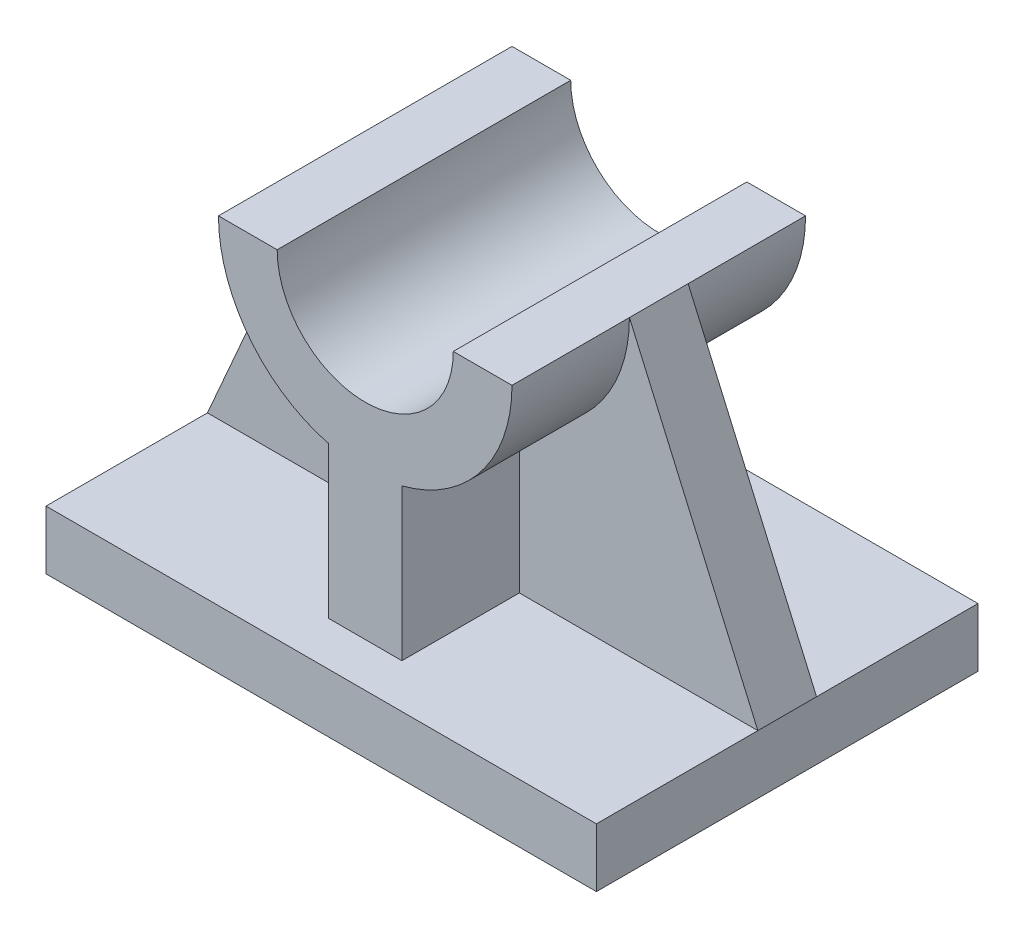
ISO-10303-21;
HEADER;
FILE_DESCRIPTION(('STEP AP214'),'2;1');
FILE_NAME('part.step','',(''),(''),'','','');
FILE_SCHEMA(('AUTOMOTIVE_DESIGN { 1 0 10303 214 1 1 1 1 }'));
ENDSEC;
DATA;
#1=APPLICATION_CONTEXT('core data for automotive mechanical design processes');
#2=APPLICATION_PROTOCOL_DEFINITION('international standard','automotive_design',2000,#1);
#3=PRODUCT_CONTEXT('',#1,'mechanical');
#4=PRODUCT('Part','Part','',(#3));
#5=PRODUCT_RELATED_PRODUCT_CATEGORY('part','',(#4));
#6=PRODUCT_DEFINITION_FORMATION('','',#4);
#7=PRODUCT_DEFINITION_CONTEXT('part definition',#1,'design');
#8=PRODUCT_DEFINITION('design','',#6,#7);
#9=PRODUCT_DEFINITION_SHAPE('','',#8);
#10=(LENGTH_UNIT() NAMED_UNIT(*) SI_UNIT(.MILLI.,.METRE.));
#11=(NAMED_UNIT(*) PLANE_ANGLE_UNIT() SI_UNIT($,.RADIAN.));
#12=(NAMED_UNIT(*) SI_UNIT($,.STERADIAN.) SOLID_ANGLE_UNIT());
#13=UNCERTAINTY_MEASURE_WITH_UNIT(LENGTH_MEASURE(1.E-05),#10,'distance_accuracy_value','');
#14=(GEOMETRIC_REPRESENTATION_CONTEXT(3) GLOBAL_UNCERTAINTY_ASSIGNED_CONTEXT((#13)) GLOBAL_UNIT_ASSIGNED_CONTEXT((#10,
#11,#12)) REPRESENTATION_CONTEXT('',''));
#15=CARTESIAN_POINT('',(0.,0.,0.));
#16=DIRECTION('',(0.,0.,1.));
#17=DIRECTION('',(1.,0.,0.));
#18=AXIS2_PLACEMENT_3D('',#15,#16,#17);
#19=CARTESIAN_POINT('',(0.,8.,26.));
#20=DIRECTION('',(0.,1.,0.));
#21=DIRECTION('',(0.,0.,1.));
#22=AXIS2_PLACEMENT_3D('',#19,#20,#21);
#23=PLANE('',#22);
#24=DIRECTION('',(0.,0.,-1.));
#25=VECTOR('',#24,1.);
#26=CARTESIAN_POINT('',(5.,8.,20.));
#27=LINE('',#26,#25);
#28=CARTESIAN_POINT('',(5.,8.,-4.));
#29=VERTEX_POINT('',#28);
#30=CARTESIAN_POINT('',(5.,8.,-20.));
#31=VERTEX_POINT('',#30);
#32=EDGE_CURVE('E337',#29,#31,#27,.T.);
#33=ORIENTED_EDGE('',*,*,#32,.F.);
#34=DIRECTION('',(1.,0.,0.));
#35=VECTOR('',#34,1.);
#36=CARTESIAN_POINT('',(0.,8.,-4.));
#37=LINE('',#36,#35);
#38=CARTESIAN_POINT('',(37.5,8.,-4.));
#39=VERTEX_POINT('',#38);
#40=EDGE_CURVE('E263',#29,#39,#37,.T.);
#41=ORIENTED_EDGE('',*,*,#40,.T.);
#42=DIRECTION('',(0.,0.,-1.));
#43=VECTOR('',#42,1.);
#44=CARTESIAN_POINT('',(37.5,8.,26.));
#45=LINE('',#44,#43);
#46=CARTESIAN_POINT('',(37.5,8.,-26.));
#47=VERTEX_POINT('',#46);
#48=EDGE_CURVE('E254',#39,#47,#45,.T.);
#49=ORIENTED_EDGE('',*,*,#48,.T.);
#50=DIRECTION('',(1.,0.,0.));
#51=VECTOR('',#50,1.);
#52=CARTESIAN_POINT('',(0.,8.,-26.));
#53=LINE('',#52,#51);
#54=CARTESIAN_POINT('',(-37.5,8.,-26.));
#55=VERTEX_POINT('',#54);
#56=EDGE_CURVE('E242',#55,#47,#53,.T.);
#57=ORIENTED_EDGE('',*,*,#56,.F.);
#58=DIRECTION('',(0.,0.,-1.));
#59=VECTOR('',#58,1.);
#60=CARTESIAN_POINT('',(-37.5,8.,26.));
#61=LINE('',#60,#59);
#62=CARTESIAN_POINT('',(-37.5,8.,-3.99999999999999));
#63=VERTEX_POINT('',#62);
#64=EDGE_CURVE('E67',#63,#55,#61,.T.);
#65=ORIENTED_EDGE('',*,*,#64,.F.);
#66=DIRECTION('',(1.,0.,0.));
#67=VECTOR('',#66,1.);
#68=CARTESIAN_POINT('',(0.,8.,-4.));
#69=LINE('',#68,#67);
#70=CARTESIAN_POINT('',(-5.,8.,-4.));
#71=VERTEX_POINT('',#70);
#72=EDGE_CURVE('E294',#63,#71,#69,.T.);
#73=ORIENTED_EDGE('',*,*,#72,.T.);
#74=DIRECTION('',(0.,0.,-1.));
#75=VECTOR('',#74,1.);
#76=CARTESIAN_POINT('',(-5.,8.,20.));
#77=LINE('',#76,#75);
#78=CARTESIAN_POINT('',(-5.,8.,-20.));
#79=VERTEX_POINT('',#78);
#80=EDGE_CURVE('E370',#71,#79,#77,.T.);
#81=ORIENTED_EDGE('',*,*,#80,.T.);
#82=DIRECTION('',(1.,0.,0.));
#83=VECTOR('',#82,1.);
#84=CARTESIAN_POINT('',(0.,8.,-20.));
#85=LINE('',#84,#83);
#86=EDGE_CURVE('E313',#79,#31,#85,.T.);
#87=ORIENTED_EDGE('',*,*,#86,.T.);
#88=EDGE_LOOP('',(#33,#41,#49,#57,#65,#73,#81,#87));
#89=FACE_BOUND('',#88,.T.);
#90=ADVANCED_FACE('F43',(#89),#23,.T.);
#91=CARTESIAN_POINT('',(5.,0.,20.));
#92=DIRECTION('',(1.,0.,0.));
#93=DIRECTION('',(0.,1.,0.));
#94=AXIS2_PLACEMENT_3D('',#91,#92,#93);
#95=PLANE('',#94);
#96=DIRECTION('',(0.,0.,-1.));
#97=VECTOR('',#96,1.);
#98=CARTESIAN_POINT('',(5.,28.6350832689629,20.));
#99=LINE('',#98,#97);
#100=CARTESIAN_POINT('',(5.,28.6350832689629,-4.));
#101=VERTEX_POINT('',#100);
#102=CARTESIAN_POINT('',(5.,28.6350832689629,-20.));
#103=VERTEX_POINT('',#102);
#104=EDGE_CURVE('E211',#101,#103,#99,.T.);
#105=ORIENTED_EDGE('',*,*,#104,.F.);
#106=DIRECTION('',(0.,-1.,0.));
#107=VECTOR('',#106,1.);
#108=CARTESIAN_POINT('',(5.,0.,-4.));
#109=LINE('',#108,#107);
#110=EDGE_CURVE('E431',#101,#29,#109,.T.);
#111=ORIENTED_EDGE('',*,*,#110,.T.);
#112=ORIENTED_EDGE('',*,*,#32,.T.);
#113=DIRECTION('',(0.,-1.,0.));
#114=VECTOR('',#113,1.);
#115=CARTESIAN_POINT('',(5.,0.,-20.));
#116=LINE('',#115,#114);
#117=EDGE_CURVE('E309',#103,#31,#116,.T.);
#118=ORIENTED_EDGE('',*,*,#117,.F.);
#119=EDGE_LOOP('',(#105,#111,#112,#118));
#120=FACE_BOUND('',#119,.T.);
#121=ADVANCED_FACE('F465',(#120),#95,.T.);
#122=CARTESIAN_POINT('',(0.,48.,20.));
#123=DIRECTION('',(0.,0.,-1.));
#124=DIRECTION('',(-1.,0.,0.));
#125=AXIS2_PLACEMENT_3D('',#122,#123,#124);
#126=CYLINDRICAL_SURFACE('',#125,20.);
#127=CARTESIAN_POINT('',(0.,48.,-4.));
#128=DIRECTION('',(0.,0.,1.));
#129=DIRECTION('',(1.,0.,0.));
#130=AXIS2_PLACEMENT_3D('',#127,#128,#129);
#131=CIRCLE('',#130,20.);
#132=CARTESIAN_POINT('',(20.,48.,-4.));
#133=VERTEX_POINT('',#132);
#134=EDGE_CURVE('E428',#101,#133,#131,.T.);
#135=ORIENTED_EDGE('',*,*,#134,.F.);
#136=ORIENTED_EDGE('',*,*,#104,.T.);
#137=CARTESIAN_POINT('',(0.,48.,-20.));
#138=DIRECTION('',(0.,0.,1.));
#139=DIRECTION('',(1.,0.,0.));
#140=AXIS2_PLACEMENT_3D('',#137,#138,#139);
#141=CIRCLE('',#140,20.);
#142=CARTESIAN_POINT('',(20.,48.,-20.));
#143=VERTEX_POINT('',#142);
#144=EDGE_CURVE('E341',#103,#143,#141,.T.);
#145=ORIENTED_EDGE('',*,*,#144,.T.);
#146=DIRECTION('',(0.,0.,-1.));
#147=VECTOR('',#146,1.);
#148=CARTESIAN_POINT('',(20.,48.,20.));
#149=LINE('',#148,#147);
#150=EDGE_CURVE('E389',#133,#143,#149,.T.);
#151=ORIENTED_EDGE('',*,*,#150,.F.);
#152=EDGE_LOOP('',(#135,#136,#145,#151));
#153=FACE_BOUND('',#152,.T.);
#154=ADVANCED_FACE('F480',(#153),#126,.T.);
#155=CARTESIAN_POINT('',(0.,48.,20.));
#156=DIRECTION('',(0.,0.,-1.));
#157=DIRECTION('',(-1.,0.,0.));
#158=AXIS2_PLACEMENT_3D('',#155,#156,#157);
#159=CYLINDRICAL_SURFACE('',#158,20.);
#160=CARTESIAN_POINT('',(0.,48.,-4.));
#161=DIRECTION('',(0.,0.,1.));
#162=DIRECTION('',(1.,0.,0.));
#163=AXIS2_PLACEMENT_3D('',#160,#161,#162);
#164=CIRCLE('',#163,20.);
#165=CARTESIAN_POINT('',(-20.,48.,-4.));
#166=VERTEX_POINT('',#165);
#167=CARTESIAN_POINT('',(-5.,28.6350832689629,-4.));
#168=VERTEX_POINT('',#167);
#169=EDGE_CURVE('E295',#166,#168,#164,.T.);
#170=ORIENTED_EDGE('',*,*,#169,.F.);
#171=DIRECTION('',(0.,0.,-1.));
#172=VECTOR('',#171,1.);
#173=CARTESIAN_POINT('',(-20.,48.,20.));
#174=LINE('',#173,#172);
#175=CARTESIAN_POINT('',(-20.,48.,-20.));
#176=VERTEX_POINT('',#175);
#177=EDGE_CURVE('E380',#166,#176,#174,.T.);
#178=ORIENTED_EDGE('',*,*,#177,.T.);
#179=CARTESIAN_POINT('',(0.,48.,-20.));
#180=DIRECTION('',(0.,0.,1.));
#181=DIRECTION('',(1.,0.,0.));
#182=AXIS2_PLACEMENT_3D('',#179,#180,#181);
#183=CIRCLE('',#182,20.);
#184=CARTESIAN_POINT('',(-5.,28.6350832689629,-20.));
#185=VERTEX_POINT('',#184);
#186=EDGE_CURVE('E357',#176,#185,#183,.T.);
#187=ORIENTED_EDGE('',*,*,#186,.T.);
#188=DIRECTION('',(0.,0.,-1.));
#189=VECTOR('',#188,1.);
#190=CARTESIAN_POINT('',(-5.,28.6350832689629,20.));
#191=LINE('',#190,#189);
#192=EDGE_CURVE('E375',#168,#185,#191,.T.);
#193=ORIENTED_EDGE('',*,*,#192,.F.);
#194=EDGE_LOOP('',(#170,#178,#187,#193));
#195=FACE_BOUND('',#194,.T.);
#196=ADVANCED_FACE('F456',(#195),#159,.T.);
#197=CARTESIAN_POINT('',(-5.,0.,20.));
#198=DIRECTION('',(1.,0.,0.));
#199=DIRECTION('',(0.,1.,0.));
#200=AXIS2_PLACEMENT_3D('',#197,#198,#199);
#201=PLANE('',#200);
#202=DIRECTION('',(0.,-1.,0.));
#203=VECTOR('',#202,1.);
#204=CARTESIAN_POINT('',(-5.,0.,-4.));
#205=LINE('',#204,#203);
#206=EDGE_CURVE('E299',#168,#71,#205,.T.);
#207=ORIENTED_EDGE('',*,*,#206,.F.);
#208=ORIENTED_EDGE('',*,*,#192,.T.);
#209=DIRECTION('',(0.,-1.,0.));
#210=VECTOR('',#209,1.);
#211=CARTESIAN_POINT('',(-5.,0.,-20.));
#212=LINE('',#211,#210);
#213=EDGE_CURVE('E361',#185,#79,#212,.T.);
#214=ORIENTED_EDGE('',*,*,#213,.T.);
#215=ORIENTED_EDGE('',*,*,#80,.F.);
#216=EDGE_LOOP('',(#207,#208,#214,#215));
#217=FACE_BOUND('',#216,.T.);
#218=ADVANCED_FACE('F472',(#217),#201,.F.);
#219=CARTESIAN_POINT('',(0.,0.,26.));
#220=DIRECTION('',(0.,1.,0.));
#221=DIRECTION('',(-1.,0.,0.));
#222=AXIS2_PLACEMENT_3D('',#219,#220,#221);
#223=PLANE('',#222);
#224=DIRECTION('',(1.,0.,0.));
#225=VECTOR('',#224,1.);
#226=CARTESIAN_POINT('',(0.,0.,-26.));
#227=LINE('',#226,#225);
#228=CARTESIAN_POINT('',(-37.5,0.,-26.));
#229=VERTEX_POINT('',#228);
#230=CARTESIAN_POINT('',(37.5,0.,-26.));
#231=VERTEX_POINT('',#230);
#232=EDGE_CURVE('E210',#229,#231,#227,.T.);
#233=ORIENTED_EDGE('',*,*,#232,.T.);
#234=DIRECTION('',(0.,0.,-1.));
#235=VECTOR('',#234,1.);
#236=CARTESIAN_POINT('',(37.5,0.,26.));
#237=LINE('',#236,#235);
#238=CARTESIAN_POINT('',(37.5,0.,26.));
#239=VERTEX_POINT('',#238);
#240=EDGE_CURVE('E11',#239,#231,#237,.T.);
#241=ORIENTED_EDGE('',*,*,#240,.F.);
#242=DIRECTION('',(1.,0.,0.));
#243=VECTOR('',#242,1.);
#244=CARTESIAN_POINT('',(0.,0.,26.));
#245=LINE('',#244,#243);
#246=CARTESIAN_POINT('',(-37.5,0.,26.));
#247=VERTEX_POINT('',#246);
#248=EDGE_CURVE('E222',#247,#239,#245,.T.);
#249=ORIENTED_EDGE('',*,*,#248,.F.);
#250=DIRECTION('',(0.,0.,-1.));
#251=VECTOR('',#250,1.);
#252=CARTESIAN_POINT('',(-37.5,0.,26.));
#253=LINE('',#252,#251);
#254=EDGE_CURVE('E237',#247,#229,#253,.T.);
#255=ORIENTED_EDGE('',*,*,#254,.T.);
#256=EDGE_LOOP('',(#233,#241,#249,#255));
#257=FACE_BOUND('',#256,.T.);
#258=ADVANCED_FACE('F45',(#257),#223,.F.);
#259=CARTESIAN_POINT('',(37.5,0.,26.));
#260=DIRECTION('',(-1.,0.,0.));
#261=DIRECTION('',(0.,0.,1.));
#262=AXIS2_PLACEMENT_3D('',#259,#260,#261);
#263=PLANE('',#262);
#264=DIRECTION('',(0.,1.,0.));
#265=VECTOR('',#264,1.);
#266=CARTESIAN_POINT('',(37.5,0.,-26.));
#267=LINE('',#266,#265);
#268=EDGE_CURVE('E216',#231,#47,#267,.T.);
#269=ORIENTED_EDGE('',*,*,#268,.T.);
#270=ORIENTED_EDGE('',*,*,#48,.F.);
#271=DIRECTION('',(0.,0.,-1.));
#272=VECTOR('',#271,1.);
#273=CARTESIAN_POINT('',(37.5,8.,4.));
#274=LINE('',#273,#272);
#275=CARTESIAN_POINT('',(37.5,8.,4.));
#276=VERTEX_POINT('',#275);
#277=EDGE_CURVE('E441',#276,#39,#274,.T.);
#278=ORIENTED_EDGE('',*,*,#277,.F.);
#279=CARTESIAN_POINT('',(37.5,8.,26.));
#280=VERTEX_POINT('',#279);
#281=EDGE_CURVE('E52',#280,#276,#45,.T.);
#282=ORIENTED_EDGE('',*,*,#281,.F.);
#283=DIRECTION('',(0.,1.,0.));
#284=VECTOR('',#283,1.);
#285=CARTESIAN_POINT('',(37.5,0.,26.));
#286=LINE('',#285,#284);
#287=EDGE_CURVE('E226',#239,#280,#286,.T.);
#288=ORIENTED_EDGE('',*,*,#287,.F.);
#289=ORIENTED_EDGE('',*,*,#240,.T.);
#290=EDGE_LOOP('',(#269,#270,#278,#282,#288,#289));
#291=FACE_BOUND('',#290,.T.);
#292=ADVANCED_FACE('F266',(#291),#263,.F.);
#293=DIRECTION('',(1.,0.,0.));
#294=VECTOR('',#293,1.);
#295=CARTESIAN_POINT('',(0.,8.,4.));
#296=LINE('',#295,#294);
#297=CARTESIAN_POINT('',(5.,8.,4.));
#298=VERTEX_POINT('',#297);
#299=EDGE_CURVE('E204',#298,#276,#296,.T.);
#300=ORIENTED_EDGE('',*,*,#299,.F.);
#301=CARTESIAN_POINT('',(5.,8.,20.));
#302=VERTEX_POINT('',#301);
#303=EDGE_CURVE('E202',#302,#298,#27,.T.);
#304=ORIENTED_EDGE('',*,*,#303,.F.);
#305=DIRECTION('',(1.,0.,0.));
#306=VECTOR('',#305,1.);
#307=CARTESIAN_POINT('',(0.,8.,20.));
#308=LINE('',#307,#306);
#309=CARTESIAN_POINT('',(-5.,8.,20.));
#310=VERTEX_POINT('',#309);
#311=EDGE_CURVE('E334',#310,#302,#308,.T.);
#312=ORIENTED_EDGE('',*,*,#311,.F.);
#313=CARTESIAN_POINT('',(-5.,8.,4.));
#314=VERTEX_POINT('',#313);
#315=EDGE_CURVE('E371',#310,#314,#77,.T.);
#316=ORIENTED_EDGE('',*,*,#315,.T.);
#317=DIRECTION('',(1.,0.,0.));
#318=VECTOR('',#317,1.);
#319=CARTESIAN_POINT('',(0.,8.,4.));
#320=LINE('',#319,#318);
#321=CARTESIAN_POINT('',(-37.5,8.,4.00000000000001));
#322=VERTEX_POINT('',#321);
#323=EDGE_CURVE('E449',#322,#314,#320,.T.);
#324=ORIENTED_EDGE('',*,*,#323,.F.);
#325=CARTESIAN_POINT('',(-37.5,8.,26.));
#326=VERTEX_POINT('',#325);
#327=EDGE_CURVE('E251',#326,#322,#61,.T.);
#328=ORIENTED_EDGE('',*,*,#327,.F.);
#329=DIRECTION('',(1.,0.,0.));
#330=VECTOR('',#329,1.);
#331=CARTESIAN_POINT('',(0.,8.,26.));
#332=LINE('',#331,#330);
#333=EDGE_CURVE('E230',#326,#280,#332,.T.);
#334=ORIENTED_EDGE('',*,*,#333,.T.);
#335=ORIENTED_EDGE('',*,*,#281,.T.);
#336=EDGE_LOOP('',(#300,#304,#312,#316,#324,#328,#334,#335));
#337=FACE_BOUND('',#336,.T.);
#338=ADVANCED_FACE('F422',(#337),#23,.T.);
#339=CARTESIAN_POINT('',(-37.5,0.,26.));
#340=DIRECTION('',(-1.,0.,0.));
#341=DIRECTION('',(0.,0.,1.));
#342=AXIS2_PLACEMENT_3D('',#339,#340,#341);
#343=PLANE('',#342);
#344=DIRECTION('',(0.,1.,0.));
#345=VECTOR('',#344,1.);
#346=CARTESIAN_POINT('',(-37.5,0.,-26.));
#347=LINE('',#346,#345);
#348=EDGE_CURVE('E227',#229,#55,#347,.T.);
#349=ORIENTED_EDGE('',*,*,#348,.F.);
#350=ORIENTED_EDGE('',*,*,#254,.F.);
#351=DIRECTION('',(0.,1.,0.));
#352=VECTOR('',#351,1.);
#353=CARTESIAN_POINT('',(-37.5,0.,26.));
#354=LINE('',#353,#352);
#355=EDGE_CURVE('E234',#247,#326,#354,.T.);
#356=ORIENTED_EDGE('',*,*,#355,.T.);
#357=ORIENTED_EDGE('',*,*,#327,.T.);
#358=DIRECTION('',(0.,0.,-1.));
#359=VECTOR('',#358,1.);
#360=CARTESIAN_POINT('',(-37.5,8.,4.));
#361=LINE('',#360,#359);
#362=EDGE_CURVE('E276',#322,#63,#361,.T.);
#363=ORIENTED_EDGE('',*,*,#362,.T.);
#364=ORIENTED_EDGE('',*,*,#64,.T.);
#365=EDGE_LOOP('',(#349,#350,#356,#357,#363,#364));
#366=FACE_BOUND('',#365,.T.);
#367=ADVANCED_FACE('F273',(#366),#343,.T.);
#368=CARTESIAN_POINT('',(0.,0.,26.));
#369=DIRECTION('',(0.,0.,1.));
#370=DIRECTION('',(1.,0.,0.));
#371=AXIS2_PLACEMENT_3D('',#368,#369,#370);
#372=PLANE('',#371);
#373=ORIENTED_EDGE('',*,*,#248,.T.);
#374=ORIENTED_EDGE('',*,*,#287,.T.);
#375=ORIENTED_EDGE('',*,*,#333,.F.);
#376=ORIENTED_EDGE('',*,*,#355,.F.);
#377=EDGE_LOOP('',(#373,#374,#375,#376));
#378=FACE_BOUND('',#377,.T.);
#379=ADVANCED_FACE('F496',(#378),#372,.T.);
#380=CARTESIAN_POINT('',(0.,0.,-26.));
#381=DIRECTION('',(0.,0.,1.));
#382=DIRECTION('',(1.,0.,0.));
#383=AXIS2_PLACEMENT_3D('',#380,#381,#382);
#384=PLANE('',#383);
#385=ORIENTED_EDGE('',*,*,#232,.F.);
#386=ORIENTED_EDGE('',*,*,#348,.T.);
#387=ORIENTED_EDGE('',*,*,#56,.T.);
#388=ORIENTED_EDGE('',*,*,#268,.F.);
#389=EDGE_LOOP('',(#385,#386,#387,#388));
#390=FACE_BOUND('',#389,.T.);
#391=ADVANCED_FACE('F270',(#390),#384,.F.);
#392=DIRECTION('',(0.,-1.,0.));
#393=VECTOR('',#392,1.);
#394=CARTESIAN_POINT('',(5.,0.,4.));
#395=LINE('',#394,#393);
#396=CARTESIAN_POINT('',(5.,28.6350832689629,4.));
#397=VERTEX_POINT('',#396);
#398=EDGE_CURVE('E185',#397,#298,#395,.T.);
#399=ORIENTED_EDGE('',*,*,#398,.F.);
#400=CARTESIAN_POINT('',(5.,28.6350832689629,20.));
#401=VERTEX_POINT('',#400);
#402=EDGE_CURVE('E199',#401,#397,#99,.T.);
#403=ORIENTED_EDGE('',*,*,#402,.F.);
#404=DIRECTION('',(0.,-1.,0.));
#405=VECTOR('',#404,1.);
#406=CARTESIAN_POINT('',(5.,0.,20.));
#407=LINE('',#406,#405);
#408=EDGE_CURVE('E310',#401,#302,#407,.T.);
#409=ORIENTED_EDGE('',*,*,#408,.T.);
#410=ORIENTED_EDGE('',*,*,#303,.T.);
#411=EDGE_LOOP('',(#399,#403,#409,#410));
#412=FACE_BOUND('',#411,.T.);
#413=ADVANCED_FACE('F197',(#412),#95,.T.);
#414=ORIENTED_EDGE('',*,*,#402,.T.);
#415=CARTESIAN_POINT('',(0.,48.,4.));
#416=DIRECTION('',(0.,0.,1.));
#417=DIRECTION('',(1.,0.,0.));
#418=AXIS2_PLACEMENT_3D('',#415,#416,#417);
#419=CIRCLE('',#418,20.);
#420=CARTESIAN_POINT('',(20.,48.,4.));
#421=VERTEX_POINT('',#420);
#422=EDGE_CURVE('E182',#397,#421,#419,.T.);
#423=ORIENTED_EDGE('',*,*,#422,.T.);
#424=CARTESIAN_POINT('',(20.,48.,20.));
#425=VERTEX_POINT('',#424);
#426=EDGE_CURVE('E218',#425,#421,#149,.T.);
#427=ORIENTED_EDGE('',*,*,#426,.F.);
#428=CARTESIAN_POINT('',(0.,48.,20.));
#429=DIRECTION('',(0.,0.,1.));
#430=DIRECTION('',(1.,0.,0.));
#431=AXIS2_PLACEMENT_3D('',#428,#429,#430);
#432=CIRCLE('',#431,20.);
#433=EDGE_CURVE('E207',#401,#425,#432,.T.);
#434=ORIENTED_EDGE('',*,*,#433,.F.);
#435=EDGE_LOOP('',(#414,#423,#427,#434));
#436=FACE_BOUND('',#435,.T.);
#437=ADVANCED_FACE('F206',(#436),#126,.T.);
#438=CARTESIAN_POINT('',(0.,48.,20.));
#439=DIRECTION('',(0.,1.,0.));
#440=DIRECTION('',(0.,0.,1.));
#441=AXIS2_PLACEMENT_3D('',#438,#439,#440);
#442=PLANE('',#441);
#443=DIRECTION('',(1.,0.,0.));
#444=VECTOR('',#443,1.);
#445=CARTESIAN_POINT('',(0.,48.,-20.));
#446=LINE('',#445,#444);
#447=CARTESIAN_POINT('',(12.,48.,-20.));
#448=VERTEX_POINT('',#447);
#449=EDGE_CURVE('E345',#448,#143,#446,.T.);
#450=ORIENTED_EDGE('',*,*,#449,.F.);
#451=DIRECTION('',(0.,0.,-1.));
#452=VECTOR('',#451,1.);
#453=CARTESIAN_POINT('',(12.,48.,20.));
#454=LINE('',#453,#452);
#455=CARTESIAN_POINT('',(12.,48.,20.));
#456=VERTEX_POINT('',#455);
#457=EDGE_CURVE('E387',#456,#448,#454,.T.);
#458=ORIENTED_EDGE('',*,*,#457,.F.);
#459=DIRECTION('',(1.,0.,0.));
#460=VECTOR('',#459,1.);
#461=CARTESIAN_POINT('',(0.,48.,20.));
#462=LINE('',#461,#460);
#463=EDGE_CURVE('E316',#456,#425,#462,.T.);
#464=ORIENTED_EDGE('',*,*,#463,.T.);
#465=ORIENTED_EDGE('',*,*,#426,.T.);
#466=DIRECTION('',(0.,0.,-1.));
#467=VECTOR('',#466,1.);
#468=CARTESIAN_POINT('',(20.,48.,4.));
#469=LINE('',#468,#467);
#470=EDGE_CURVE('E399',#421,#133,#469,.T.);
#471=ORIENTED_EDGE('',*,*,#470,.T.);
#472=ORIENTED_EDGE('',*,*,#150,.T.);
#473=EDGE_LOOP('',(#450,#458,#464,#465,#471,#472));
#474=FACE_BOUND('',#473,.T.);
#475=ADVANCED_FACE('F398',(#474),#442,.T.);
#476=CARTESIAN_POINT('',(0.,48.,20.));
#477=DIRECTION('',(0.,0.,-1.));
#478=DIRECTION('',(-1.,0.,0.));
#479=AXIS2_PLACEMENT_3D('',#476,#477,#478);
#480=CYLINDRICAL_SURFACE('',#479,12.);
#481=CARTESIAN_POINT('',(0.,48.,-20.));
#482=DIRECTION('',(0.,0.,1.));
#483=DIRECTION('',(1.,0.,0.));
#484=AXIS2_PLACEMENT_3D('',#481,#482,#483);
#485=CIRCLE('',#484,12.);
#486=CARTESIAN_POINT('',(-12.,48.,-20.));
#487=VERTEX_POINT('',#486);
#488=EDGE_CURVE('E349',#487,#448,#485,.T.);
#489=ORIENTED_EDGE('',*,*,#488,.F.);
#490=DIRECTION('',(0.,0.,-1.));
#491=VECTOR('',#490,1.);
#492=CARTESIAN_POINT('',(-12.,48.,20.));
#493=LINE('',#492,#491);
#494=CARTESIAN_POINT('',(-12.,48.,20.));
#495=VERTEX_POINT('',#494);
#496=EDGE_CURVE('E385',#495,#487,#493,.T.);
#497=ORIENTED_EDGE('',*,*,#496,.F.);
#498=CARTESIAN_POINT('',(0.,48.,20.));
#499=DIRECTION('',(0.,0.,1.));
#500=DIRECTION('',(1.,0.,0.));
#501=AXIS2_PLACEMENT_3D('',#498,#499,#500);
#502=CIRCLE('',#501,12.);
#503=EDGE_CURVE('E320',#495,#456,#502,.T.);
#504=ORIENTED_EDGE('',*,*,#503,.T.);
#505=ORIENTED_EDGE('',*,*,#457,.T.);
#506=EDGE_LOOP('',(#489,#497,#504,#505));
#507=FACE_BOUND('',#506,.T.);
#508=ADVANCED_FACE('F405',(#507),#480,.F.);
#509=CARTESIAN_POINT('',(0.,48.,20.));
#510=DIRECTION('',(0.,1.,0.));
#511=DIRECTION('',(0.,0.,1.));
#512=AXIS2_PLACEMENT_3D('',#509,#510,#511);
#513=PLANE('',#512);
#514=DIRECTION('',(1.,0.,0.));
#515=VECTOR('',#514,1.);
#516=CARTESIAN_POINT('',(0.,48.,-20.));
#517=LINE('',#516,#515);
#518=EDGE_CURVE('E353',#176,#487,#517,.T.);
#519=ORIENTED_EDGE('',*,*,#518,.F.);
#520=ORIENTED_EDGE('',*,*,#177,.F.);
#521=DIRECTION('',(0.,0.,-1.));
#522=VECTOR('',#521,1.);
#523=CARTESIAN_POINT('',(-20.,48.,4.));
#524=LINE('',#523,#522);
#525=CARTESIAN_POINT('',(-20.,48.,4.));
#526=VERTEX_POINT('',#525);
#527=EDGE_CURVE('E283',#526,#166,#524,.T.);
#528=ORIENTED_EDGE('',*,*,#527,.F.);
#529=CARTESIAN_POINT('',(-20.,48.,20.));
#530=VERTEX_POINT('',#529);
#531=EDGE_CURVE('E381',#530,#526,#174,.T.);
#532=ORIENTED_EDGE('',*,*,#531,.F.);
#533=DIRECTION('',(1.,0.,0.));
#534=VECTOR('',#533,1.);
#535=CARTESIAN_POINT('',(0.,48.,20.));
#536=LINE('',#535,#534);
#537=EDGE_CURVE('E324',#530,#495,#536,.T.);
#538=ORIENTED_EDGE('',*,*,#537,.T.);
#539=ORIENTED_EDGE('',*,*,#496,.T.);
#540=EDGE_LOOP('',(#519,#520,#528,#532,#538,#539));
#541=FACE_BOUND('',#540,.T.);
#542=ADVANCED_FACE('F408',(#541),#513,.T.);
#543=ORIENTED_EDGE('',*,*,#531,.T.);
#544=CARTESIAN_POINT('',(0.,48.,4.));
#545=DIRECTION('',(0.,0.,1.));
#546=DIRECTION('',(1.,0.,0.));
#547=AXIS2_PLACEMENT_3D('',#544,#545,#546);
#548=CIRCLE('',#547,20.);
#549=CARTESIAN_POINT('',(-5.,28.6350832689629,4.));
#550=VERTEX_POINT('',#549);
#551=EDGE_CURVE('E303',#526,#550,#548,.T.);
#552=ORIENTED_EDGE('',*,*,#551,.T.);
#553=CARTESIAN_POINT('',(-5.,28.6350832689629,20.));
#554=VERTEX_POINT('',#553);
#555=EDGE_CURVE('E376',#554,#550,#191,.T.);
#556=ORIENTED_EDGE('',*,*,#555,.F.);
#557=CARTESIAN_POINT('',(0.,48.,20.));
#558=DIRECTION('',(0.,0.,1.));
#559=DIRECTION('',(1.,0.,0.));
#560=AXIS2_PLACEMENT_3D('',#557,#558,#559);
#561=CIRCLE('',#560,20.);
#562=EDGE_CURVE('E328',#530,#554,#561,.T.);
#563=ORIENTED_EDGE('',*,*,#562,.F.);
#564=EDGE_LOOP('',(#543,#552,#556,#563));
#565=FACE_BOUND('',#564,.T.);
#566=ADVANCED_FACE('F415',(#565),#159,.T.);
#567=ORIENTED_EDGE('',*,*,#555,.T.);
#568=DIRECTION('',(0.,-1.,0.));
#569=VECTOR('',#568,1.);
#570=CARTESIAN_POINT('',(-5.,0.,4.));
#571=LINE('',#570,#569);
#572=EDGE_CURVE('E284',#550,#314,#571,.T.);
#573=ORIENTED_EDGE('',*,*,#572,.T.);
#574=ORIENTED_EDGE('',*,*,#315,.F.);
#575=DIRECTION('',(0.,-1.,0.));
#576=VECTOR('',#575,1.);
#577=CARTESIAN_POINT('',(-5.,0.,20.));
#578=LINE('',#577,#576);
#579=EDGE_CURVE('E331',#554,#310,#578,.T.);
#580=ORIENTED_EDGE('',*,*,#579,.F.);
#581=EDGE_LOOP('',(#567,#573,#574,#580));
#582=FACE_BOUND('',#581,.T.);
#583=ADVANCED_FACE('F419',(#582),#201,.F.);
#584=CARTESIAN_POINT('',(0.,0.,20.));
#585=DIRECTION('',(0.,0.,1.));
#586=DIRECTION('',(1.,0.,0.));
#587=AXIS2_PLACEMENT_3D('',#584,#585,#586);
#588=PLANE('',#587);
#589=ORIENTED_EDGE('',*,*,#408,.F.);
#590=ORIENTED_EDGE('',*,*,#433,.T.);
#591=ORIENTED_EDGE('',*,*,#463,.F.);
#592=ORIENTED_EDGE('',*,*,#503,.F.);
#593=ORIENTED_EDGE('',*,*,#537,.F.);
#594=ORIENTED_EDGE('',*,*,#562,.T.);
#595=ORIENTED_EDGE('',*,*,#579,.T.);
#596=ORIENTED_EDGE('',*,*,#311,.T.);
#597=EDGE_LOOP('',(#589,#590,#591,#592,#593,#594,#595,#596));
#598=FACE_BOUND('',#597,.T.);
#599=ADVANCED_FACE('F403',(#598),#588,.T.);
#600=CARTESIAN_POINT('',(0.,0.,-20.));
#601=DIRECTION('',(0.,0.,1.));
#602=DIRECTION('',(1.,0.,0.));
#603=AXIS2_PLACEMENT_3D('',#600,#601,#602);
#604=PLANE('',#603);
#605=ORIENTED_EDGE('',*,*,#117,.T.);
#606=ORIENTED_EDGE('',*,*,#86,.F.);
#607=ORIENTED_EDGE('',*,*,#213,.F.);
#608=ORIENTED_EDGE('',*,*,#186,.F.);
#609=ORIENTED_EDGE('',*,*,#518,.T.);
#610=ORIENTED_EDGE('',*,*,#488,.T.);
#611=ORIENTED_EDGE('',*,*,#449,.T.);
#612=ORIENTED_EDGE('',*,*,#144,.F.);
#613=EDGE_LOOP('',(#605,#606,#607,#608,#609,#610,#611,#612));
#614=FACE_BOUND('',#613,.T.);
#615=ADVANCED_FACE('F469',(#614),#604,.F.);
#616=CARTESIAN_POINT('',(-34.4131147540984,15.055737704918,4.));
#617=DIRECTION('',(0.916157334902189,-0.400818834019708,0.));
#618=DIRECTION('',(0.400818834019708,0.916157334902189,0.));
#619=AXIS2_PLACEMENT_3D('',#616,#617,#618);
#620=PLANE('',#619);
#621=DIRECTION('',(-0.400818834019708,-0.916157334902189,0.));
#622=VECTOR('',#621,1.);
#623=CARTESIAN_POINT('',(-34.4131147540984,15.055737704918,-4.));
#624=LINE('',#623,#622);
#625=EDGE_CURVE('E288',#166,#63,#624,.T.);
#626=ORIENTED_EDGE('',*,*,#625,.T.);
#627=ORIENTED_EDGE('',*,*,#362,.F.);
#628=DIRECTION('',(-0.400818834019708,-0.916157334902189,0.));
#629=VECTOR('',#628,1.);
#630=CARTESIAN_POINT('',(-34.4131147540984,15.055737704918,4.));
#631=LINE('',#630,#629);
#632=EDGE_CURVE('E446',#526,#322,#631,.T.);
#633=ORIENTED_EDGE('',*,*,#632,.F.);
#634=ORIENTED_EDGE('',*,*,#527,.T.);
#635=EDGE_LOOP('',(#626,#627,#633,#634));
#636=FACE_BOUND('',#635,.T.);
#637=ADVANCED_FACE('F290',(#636),#620,.F.);
#638=CARTESIAN_POINT('',(0.,0.,4.));
#639=DIRECTION('',(0.,0.,1.));
#640=DIRECTION('',(1.,0.,0.));
#641=AXIS2_PLACEMENT_3D('',#638,#639,#640);
#642=PLANE('',#641);
#643=ORIENTED_EDGE('',*,*,#551,.F.);
#644=ORIENTED_EDGE('',*,*,#632,.T.);
#645=ORIENTED_EDGE('',*,*,#323,.T.);
#646=ORIENTED_EDGE('',*,*,#572,.F.);
#647=EDGE_LOOP('',(#643,#644,#645,#646));
#648=FACE_BOUND('',#647,.T.);
#649=ADVANCED_FACE('F669',(#648),#642,.T.);
#650=CARTESIAN_POINT('',(0.,0.,-4.));
#651=DIRECTION('',(0.,0.,1.));
#652=DIRECTION('',(1.,0.,0.));
#653=AXIS2_PLACEMENT_3D('',#650,#651,#652);
#654=PLANE('',#653);
#655=ORIENTED_EDGE('',*,*,#169,.T.);
#656=ORIENTED_EDGE('',*,*,#206,.T.);
#657=ORIENTED_EDGE('',*,*,#72,.F.);
#658=ORIENTED_EDGE('',*,*,#625,.F.);
#659=EDGE_LOOP('',(#655,#656,#657,#658));
#660=FACE_BOUND('',#659,.T.);
#661=ADVANCED_FACE('F298',(#660),#654,.F.);
#662=CARTESIAN_POINT('',(34.4131147540984,15.055737704918,4.));
#663=DIRECTION('',(0.916157334902189,0.400818834019708,0.));
#664=DIRECTION('',(-0.400818834019708,0.916157334902189,0.));
#665=AXIS2_PLACEMENT_3D('',#662,#663,#664);
#666=PLANE('',#665);
#667=DIRECTION('',(0.400818834019708,-0.916157334902189,0.));
#668=VECTOR('',#667,1.);
#669=CARTESIAN_POINT('',(34.4131147540984,15.055737704918,-4.));
#670=LINE('',#669,#668);
#671=EDGE_CURVE('E59',#133,#39,#670,.T.);
#672=ORIENTED_EDGE('',*,*,#671,.F.);
#673=ORIENTED_EDGE('',*,*,#470,.F.);
#674=DIRECTION('',(0.400818834019708,-0.916157334902189,0.));
#675=VECTOR('',#674,1.);
#676=CARTESIAN_POINT('',(34.4131147540984,15.055737704918,4.));
#677=LINE('',#676,#675);
#678=EDGE_CURVE('E188',#421,#276,#677,.T.);
#679=ORIENTED_EDGE('',*,*,#678,.T.);
#680=ORIENTED_EDGE('',*,*,#277,.T.);
#681=EDGE_LOOP('',(#672,#673,#679,#680));
#682=FACE_BOUND('',#681,.T.);
#683=ADVANCED_FACE('F688',(#682),#666,.T.);
#684=CARTESIAN_POINT('',(0.,0.,4.));
#685=DIRECTION('',(0.,0.,1.));
#686=DIRECTION('',(1.,0.,0.));
#687=AXIS2_PLACEMENT_3D('',#684,#685,#686);
#688=PLANE('',#687);
#689=ORIENTED_EDGE('',*,*,#422,.F.);
#690=ORIENTED_EDGE('',*,*,#398,.T.);
#691=ORIENTED_EDGE('',*,*,#299,.T.);
#692=ORIENTED_EDGE('',*,*,#678,.F.);
#693=EDGE_LOOP('',(#689,#690,#691,#692));
#694=FACE_BOUND('',#693,.T.);
#695=ADVANCED_FACE('F184',(#694),#688,.T.);
#696=CARTESIAN_POINT('',(0.,0.,-4.));
#697=DIRECTION('',(0.,0.,1.));
#698=DIRECTION('',(1.,0.,0.));
#699=AXIS2_PLACEMENT_3D('',#696,#697,#698);
#700=PLANE('',#699);
#701=ORIENTED_EDGE('',*,*,#134,.T.);
#702=ORIENTED_EDGE('',*,*,#671,.T.);
#703=ORIENTED_EDGE('',*,*,#40,.F.);
#704=ORIENTED_EDGE('',*,*,#110,.F.);
#705=EDGE_LOOP('',(#701,#702,#703,#704));
#706=FACE_BOUND('',#705,.T.);
#707=ADVANCED_FACE('F707',(#706),#700,.F.);
#708=CLOSED_SHELL('',(#90,#121,#154,#196,#218,#258,#292,#338,#367,#379,#391,#413,#437,#475,#508,
#542,#566,#583,#599,#615,#637,#649,#661,#683,#695,#707));
#709=MANIFOLD_SOLID_BREP('B2',#708);
#710=ADVANCED_BREP_SHAPE_REPRESENTATION('',(#18,#709),#14);
#711=SHAPE_DEFINITION_REPRESENTATION(#9,#710);
ENDSEC;
END-ISO-10303-21;
